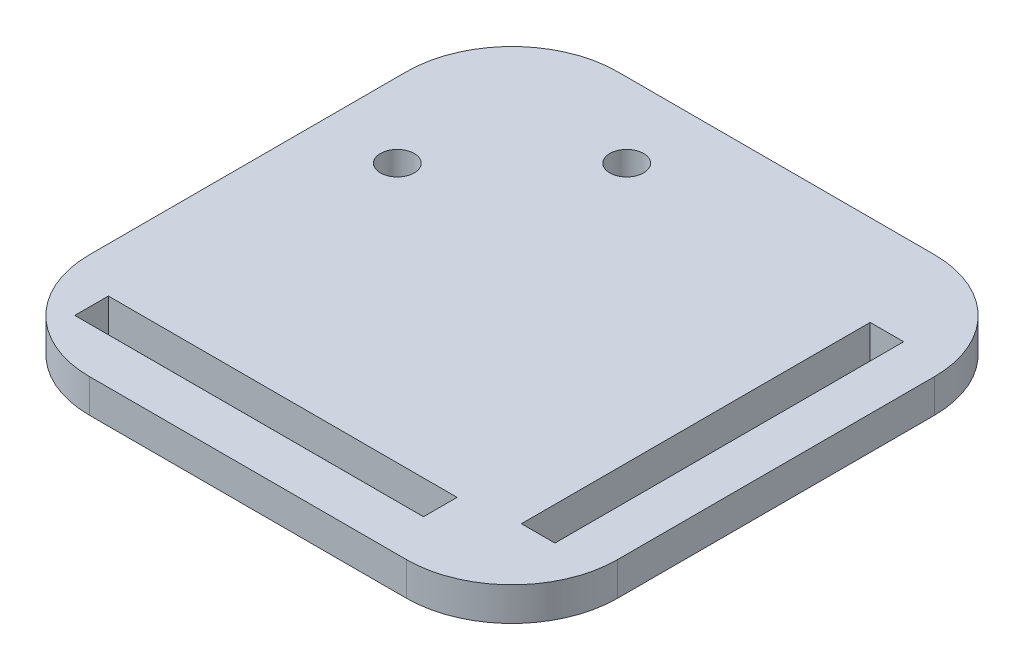
ISO-10303-21;
HEADER;
FILE_DESCRIPTION(('STEP AP214'),'2;1');
FILE_NAME('part.step','',(''),(''),'','','');
FILE_SCHEMA(('AUTOMOTIVE_DESIGN { 1 0 10303 214 1 1 1 1 }'));
ENDSEC;
DATA;
#1=APPLICATION_CONTEXT('core data for automotive mechanical design processes');
#2=APPLICATION_PROTOCOL_DEFINITION('international standard','automotive_design',2000,#1);
#3=PRODUCT_CONTEXT('',#1,'mechanical');
#4=PRODUCT('Part','Part','',(#3));
#5=PRODUCT_RELATED_PRODUCT_CATEGORY('part','',(#4));
#6=PRODUCT_DEFINITION_FORMATION('','',#4);
#7=PRODUCT_DEFINITION_CONTEXT('part definition',#1,'design');
#8=PRODUCT_DEFINITION('design','',#6,#7);
#9=PRODUCT_DEFINITION_SHAPE('','',#8);
#10=(LENGTH_UNIT() NAMED_UNIT(*) SI_UNIT(.MILLI.,.METRE.));
#11=(NAMED_UNIT(*) PLANE_ANGLE_UNIT() SI_UNIT($,.RADIAN.));
#12=(NAMED_UNIT(*) SI_UNIT($,.STERADIAN.) SOLID_ANGLE_UNIT());
#13=UNCERTAINTY_MEASURE_WITH_UNIT(LENGTH_MEASURE(1.E-05),#10,'distance_accuracy_value','');
#14=(GEOMETRIC_REPRESENTATION_CONTEXT(3) GLOBAL_UNCERTAINTY_ASSIGNED_CONTEXT((#13)) GLOBAL_UNIT_ASSIGNED_CONTEXT((#10,
#11,#12)) REPRESENTATION_CONTEXT('',''));
#15=CARTESIAN_POINT('',(0.,0.,0.));
#16=DIRECTION('',(0.,0.,1.));
#17=DIRECTION('',(1.,0.,0.));
#18=AXIS2_PLACEMENT_3D('',#15,#16,#17);
#19=CARTESIAN_POINT('',(25.,3.175,-25.));
#20=DIRECTION('',(-1.,0.,0.));
#21=DIRECTION('',(0.,0.,1.));
#22=AXIS2_PLACEMENT_3D('',#19,#20,#21);
#23=PLANE('',#22);
#24=DIRECTION('',(0.,0.,-1.));
#25=VECTOR('',#24,1.);
#26=CARTESIAN_POINT('',(25.,0.,-25.));
#27=LINE('',#26,#25);
#28=CARTESIAN_POINT('',(25.,0.,15.));
#29=VERTEX_POINT('',#28);
#30=CARTESIAN_POINT('',(25.,0.,-15.));
#31=VERTEX_POINT('',#30);
#32=EDGE_CURVE('E220',#29,#31,#27,.T.);
#33=ORIENTED_EDGE('',*,*,#32,.T.);
#34=DIRECTION('',(0.,-1.,0.));
#35=VECTOR('',#34,1.);
#36=CARTESIAN_POINT('',(25.,3.175,-15.));
#37=LINE('',#36,#35);
#38=CARTESIAN_POINT('',(25.,3.175,-15.));
#39=VERTEX_POINT('',#38);
#40=EDGE_CURVE('E11',#31,#39,#37,.F.);
#41=ORIENTED_EDGE('',*,*,#40,.T.);
#42=DIRECTION('',(0.,0.,-1.));
#43=VECTOR('',#42,1.);
#44=CARTESIAN_POINT('',(25.,3.175,-25.));
#45=LINE('',#44,#43);
#46=CARTESIAN_POINT('',(25.,3.175,15.));
#47=VERTEX_POINT('',#46);
#48=EDGE_CURVE('E227',#47,#39,#45,.T.);
#49=ORIENTED_EDGE('',*,*,#48,.F.);
#50=DIRECTION('',(0.,-1.,0.));
#51=VECTOR('',#50,1.);
#52=CARTESIAN_POINT('',(25.,3.175,15.));
#53=LINE('',#52,#51);
#54=EDGE_CURVE('E41',#47,#29,#53,.T.);
#55=ORIENTED_EDGE('',*,*,#54,.T.);
#56=EDGE_LOOP('',(#33,#41,#49,#55));
#57=FACE_BOUND('',#56,.T.);
#58=ADVANCED_FACE('F33',(#57),#23,.F.);
#59=CARTESIAN_POINT('',(-25.,3.175,-25.));
#60=DIRECTION('',(0.,0.,1.));
#61=DIRECTION('',(1.,0.,0.));
#62=AXIS2_PLACEMENT_3D('',#59,#60,#61);
#63=PLANE('',#62);
#64=DIRECTION('',(-1.,0.,0.));
#65=VECTOR('',#64,1.);
#66=CARTESIAN_POINT('',(-25.,0.,-25.));
#67=LINE('',#66,#65);
#68=CARTESIAN_POINT('',(15.,0.,-25.));
#69=VERTEX_POINT('',#68);
#70=CARTESIAN_POINT('',(-15.,0.,-25.));
#71=VERTEX_POINT('',#70);
#72=EDGE_CURVE('E241',#69,#71,#67,.T.);
#73=ORIENTED_EDGE('',*,*,#72,.T.);
#74=DIRECTION('',(0.,-1.,0.));
#75=VECTOR('',#74,1.);
#76=CARTESIAN_POINT('',(-15.,3.175,-25.));
#77=LINE('',#76,#75);
#78=CARTESIAN_POINT('',(-15.,3.175,-25.));
#79=VERTEX_POINT('',#78);
#80=EDGE_CURVE('E263',#71,#79,#77,.F.);
#81=ORIENTED_EDGE('',*,*,#80,.T.);
#82=DIRECTION('',(-1.,0.,0.));
#83=VECTOR('',#82,1.);
#84=CARTESIAN_POINT('',(-25.,3.175,-25.));
#85=LINE('',#84,#83);
#86=CARTESIAN_POINT('',(15.,3.175,-25.));
#87=VERTEX_POINT('',#86);
#88=EDGE_CURVE('E230',#87,#79,#85,.T.);
#89=ORIENTED_EDGE('',*,*,#88,.F.);
#90=DIRECTION('',(0.,-1.,0.));
#91=VECTOR('',#90,1.);
#92=CARTESIAN_POINT('',(15.,3.175,-25.));
#93=LINE('',#92,#91);
#94=EDGE_CURVE('E260',#87,#69,#93,.T.);
#95=ORIENTED_EDGE('',*,*,#94,.T.);
#96=EDGE_LOOP('',(#73,#81,#89,#95));
#97=FACE_BOUND('',#96,.T.);
#98=ADVANCED_FACE('F293',(#97),#63,.F.);
#99=CARTESIAN_POINT('',(-25.,3.175,-25.));
#100=DIRECTION('',(1.,0.,0.));
#101=DIRECTION('',(0.,0.,-1.));
#102=AXIS2_PLACEMENT_3D('',#99,#100,#101);
#103=PLANE('',#102);
#104=DIRECTION('',(0.,0.,1.));
#105=VECTOR('',#104,1.);
#106=CARTESIAN_POINT('',(-25.,3.175,-25.));
#107=LINE('',#106,#105);
#108=CARTESIAN_POINT('',(-25.,3.175,-15.));
#109=VERTEX_POINT('',#108);
#110=CARTESIAN_POINT('',(-25.,3.175,15.));
#111=VERTEX_POINT('',#110);
#112=EDGE_CURVE('E234',#109,#111,#107,.T.);
#113=ORIENTED_EDGE('',*,*,#112,.F.);
#114=DIRECTION('',(0.,-1.,0.));
#115=VECTOR('',#114,1.);
#116=CARTESIAN_POINT('',(-25.,3.175,-15.));
#117=LINE('',#116,#115);
#118=CARTESIAN_POINT('',(-25.,0.,-15.));
#119=VERTEX_POINT('',#118);
#120=EDGE_CURVE('E249',#109,#119,#117,.T.);
#121=ORIENTED_EDGE('',*,*,#120,.T.);
#122=DIRECTION('',(0.,0.,1.));
#123=VECTOR('',#122,1.);
#124=CARTESIAN_POINT('',(-25.,0.,-25.));
#125=LINE('',#124,#123);
#126=CARTESIAN_POINT('',(-25.,0.,15.));
#127=VERTEX_POINT('',#126);
#128=EDGE_CURVE('E244',#119,#127,#125,.T.);
#129=ORIENTED_EDGE('',*,*,#128,.T.);
#130=DIRECTION('',(0.,-1.,0.));
#131=VECTOR('',#130,1.);
#132=CARTESIAN_POINT('',(-25.,3.175,15.));
#133=LINE('',#132,#131);
#134=EDGE_CURVE('E238',#127,#111,#133,.F.);
#135=ORIENTED_EDGE('',*,*,#134,.T.);
#136=EDGE_LOOP('',(#113,#121,#129,#135));
#137=FACE_BOUND('',#136,.T.);
#138=ADVANCED_FACE('F302',(#137),#103,.F.);
#139=CARTESIAN_POINT('',(-25.,3.175,25.));
#140=DIRECTION('',(0.,0.,-1.));
#141=DIRECTION('',(-1.,0.,0.));
#142=AXIS2_PLACEMENT_3D('',#139,#140,#141);
#143=PLANE('',#142);
#144=DIRECTION('',(1.,0.,0.));
#145=VECTOR('',#144,1.);
#146=CARTESIAN_POINT('',(-25.,3.175,25.));
#147=LINE('',#146,#145);
#148=CARTESIAN_POINT('',(-15.,3.175,25.));
#149=VERTEX_POINT('',#148);
#150=CARTESIAN_POINT('',(15.,3.175,25.));
#151=VERTEX_POINT('',#150);
#152=EDGE_CURVE('E236',#149,#151,#147,.T.);
#153=ORIENTED_EDGE('',*,*,#152,.F.);
#154=DIRECTION('',(0.,-1.,0.));
#155=VECTOR('',#154,1.);
#156=CARTESIAN_POINT('',(-15.,3.175,25.));
#157=LINE('',#156,#155);
#158=CARTESIAN_POINT('',(-15.,0.,25.));
#159=VERTEX_POINT('',#158);
#160=EDGE_CURVE('E273',#149,#159,#157,.T.);
#161=ORIENTED_EDGE('',*,*,#160,.T.);
#162=DIRECTION('',(1.,0.,0.));
#163=VECTOR('',#162,1.);
#164=CARTESIAN_POINT('',(-25.,0.,25.));
#165=LINE('',#164,#163);
#166=CARTESIAN_POINT('',(15.,0.,25.));
#167=VERTEX_POINT('',#166);
#168=EDGE_CURVE('E231',#159,#167,#165,.T.);
#169=ORIENTED_EDGE('',*,*,#168,.T.);
#170=DIRECTION('',(0.,-1.,0.));
#171=VECTOR('',#170,1.);
#172=CARTESIAN_POINT('',(15.,3.175,25.));
#173=LINE('',#172,#171);
#174=EDGE_CURVE('E48',#167,#151,#173,.F.);
#175=ORIENTED_EDGE('',*,*,#174,.T.);
#176=EDGE_LOOP('',(#153,#161,#169,#175));
#177=FACE_BOUND('',#176,.T.);
#178=ADVANCED_FACE('F307',(#177),#143,.F.);
#179=CARTESIAN_POINT('',(0.,3.175,0.));
#180=DIRECTION('',(0.,1.,0.));
#181=DIRECTION('',(0.,0.,1.));
#182=AXIS2_PLACEMENT_3D('',#179,#180,#181);
#183=PLANE('',#182);
#184=CARTESIAN_POINT('',(-17.9289321881345,3.175,-7.07106781186547));
#185=DIRECTION('',(0.,1.,0.));
#186=DIRECTION('',(0.,0.,1.));
#187=AXIS2_PLACEMENT_3D('',#184,#185,#186);
#188=CIRCLE('',#187,1.6);
#189=CARTESIAN_POINT('',(-17.9289321881345,3.175,-5.47106781186547));
#190=VERTEX_POINT('',#189);
#191=EDGE_CURVE('E477',#190,#190,#188,.T.);
#192=ORIENTED_EDGE('',*,*,#191,.F.);
#193=EDGE_LOOP('',(#192));
#194=FACE_BOUND('',#193,.T.);
#195=CARTESIAN_POINT('',(-7.07106781186546,3.175,-17.9289321881345));
#196=DIRECTION('',(0.,1.,0.));
#197=DIRECTION('',(0.,0.,1.));
#198=AXIS2_PLACEMENT_3D('',#195,#196,#197);
#199=CIRCLE('',#198,1.6);
#200=CARTESIAN_POINT('',(-7.07106781186546,3.175,-16.3289321881345));
#201=VERTEX_POINT('',#200);
#202=EDGE_CURVE('E178',#201,#201,#199,.T.);
#203=ORIENTED_EDGE('',*,*,#202,.F.);
#204=EDGE_LOOP('',(#203));
#205=FACE_BOUND('',#204,.T.);
#206=DIRECTION('',(0.,0.,-1.));
#207=VECTOR('',#206,1.);
#208=CARTESIAN_POINT('',(12.3,3.175,17.5));
#209=LINE('',#208,#207);
#210=CARTESIAN_POINT('',(12.3,3.175,20.68));
#211=VERTEX_POINT('',#210);
#212=CARTESIAN_POINT('',(12.3,3.175,17.5));
#213=VERTEX_POINT('',#212);
#214=EDGE_CURVE('E154',#211,#213,#209,.T.);
#215=ORIENTED_EDGE('',*,*,#214,.F.);
#216=DIRECTION('',(1.,0.,0.));
#217=VECTOR('',#216,1.);
#218=CARTESIAN_POINT('',(-20.72,3.175,20.68));
#219=LINE('',#218,#217);
#220=CARTESIAN_POINT('',(-20.72,3.175,20.68));
#221=VERTEX_POINT('',#220);
#222=EDGE_CURVE('E172',#221,#211,#219,.T.);
#223=ORIENTED_EDGE('',*,*,#222,.F.);
#224=DIRECTION('',(0.,0.,1.));
#225=VECTOR('',#224,1.);
#226=CARTESIAN_POINT('',(-20.72,3.175,17.5));
#227=LINE('',#226,#225);
#228=CARTESIAN_POINT('',(-20.72,3.175,17.5));
#229=VERTEX_POINT('',#228);
#230=EDGE_CURVE('E175',#229,#221,#227,.T.);
#231=ORIENTED_EDGE('',*,*,#230,.F.);
#232=DIRECTION('',(-1.,0.,0.));
#233=VECTOR('',#232,1.);
#234=CARTESIAN_POINT('',(-20.72,3.175,17.5));
#235=LINE('',#234,#233);
#236=EDGE_CURVE('E184',#213,#229,#235,.T.);
#237=ORIENTED_EDGE('',*,*,#236,.F.);
#238=EDGE_LOOP('',(#215,#223,#231,#237));
#239=FACE_BOUND('',#238,.T.);
#240=DIRECTION('',(0.,0.,-1.));
#241=VECTOR('',#240,1.);
#242=CARTESIAN_POINT('',(20.682,3.175,-16.402));
#243=LINE('',#242,#241);
#244=CARTESIAN_POINT('',(20.682,3.175,16.618));
#245=VERTEX_POINT('',#244);
#246=CARTESIAN_POINT('',(20.682,3.175,-16.402));
#247=VERTEX_POINT('',#246);
#248=EDGE_CURVE('E191',#245,#247,#243,.T.);
#249=ORIENTED_EDGE('',*,*,#248,.F.);
#250=DIRECTION('',(1.,0.,0.));
#251=VECTOR('',#250,1.);
#252=CARTESIAN_POINT('',(17.507,3.175,16.618));
#253=LINE('',#252,#251);
#254=CARTESIAN_POINT('',(17.507,3.175,16.618));
#255=VERTEX_POINT('',#254);
#256=EDGE_CURVE('E199',#255,#245,#253,.T.);
#257=ORIENTED_EDGE('',*,*,#256,.F.);
#258=DIRECTION('',(0.,0.,1.));
#259=VECTOR('',#258,1.);
#260=CARTESIAN_POINT('',(17.507,3.175,-16.402));
#261=LINE('',#260,#259);
#262=CARTESIAN_POINT('',(17.507,3.175,-16.402));
#263=VERTEX_POINT('',#262);
#264=EDGE_CURVE('E213',#263,#255,#261,.T.);
#265=ORIENTED_EDGE('',*,*,#264,.F.);
#266=DIRECTION('',(-1.,0.,0.));
#267=VECTOR('',#266,1.);
#268=CARTESIAN_POINT('',(17.507,3.175,-16.402));
#269=LINE('',#268,#267);
#270=EDGE_CURVE('E210',#247,#263,#269,.T.);
#271=ORIENTED_EDGE('',*,*,#270,.F.);
#272=EDGE_LOOP('',(#249,#257,#265,#271));
#273=FACE_BOUND('',#272,.T.);
#274=ORIENTED_EDGE('',*,*,#88,.T.);
#275=CARTESIAN_POINT('',(-15.,3.175,-15.));
#276=DIRECTION('',(0.,1.,0.));
#277=DIRECTION('',(0.,0.,1.));
#278=AXIS2_PLACEMENT_3D('',#275,#276,#277);
#279=CIRCLE('',#278,10.);
#280=EDGE_CURVE('E270',#79,#109,#279,.T.);
#281=ORIENTED_EDGE('',*,*,#280,.T.);
#282=ORIENTED_EDGE('',*,*,#112,.T.);
#283=CARTESIAN_POINT('',(-15.,3.175,15.));
#284=DIRECTION('',(0.,1.,0.));
#285=DIRECTION('',(0.,0.,1.));
#286=AXIS2_PLACEMENT_3D('',#283,#284,#285);
#287=CIRCLE('',#286,10.);
#288=EDGE_CURVE('E55',#111,#149,#287,.T.);
#289=ORIENTED_EDGE('',*,*,#288,.T.);
#290=ORIENTED_EDGE('',*,*,#152,.T.);
#291=CARTESIAN_POINT('',(15.,3.175,15.));
#292=DIRECTION('',(0.,1.,0.));
#293=DIRECTION('',(0.,0.,1.));
#294=AXIS2_PLACEMENT_3D('',#291,#292,#293);
#295=CIRCLE('',#294,10.);
#296=EDGE_CURVE('E265',#151,#47,#295,.T.);
#297=ORIENTED_EDGE('',*,*,#296,.T.);
#298=ORIENTED_EDGE('',*,*,#48,.T.);
#299=CARTESIAN_POINT('',(15.,3.175,-15.));
#300=DIRECTION('',(0.,1.,0.));
#301=DIRECTION('',(0.,0.,1.));
#302=AXIS2_PLACEMENT_3D('',#299,#300,#301);
#303=CIRCLE('',#302,10.);
#304=EDGE_CURVE('E267',#39,#87,#303,.T.);
#305=ORIENTED_EDGE('',*,*,#304,.T.);
#306=EDGE_LOOP('',(#274,#281,#282,#289,#290,#297,#298,#305));
#307=FACE_BOUND('',#306,.T.);
#308=ADVANCED_FACE('F296',(#194,#205,#239,#273,#307),#183,.T.);
#309=CARTESIAN_POINT('',(0.,0.,0.));
#310=DIRECTION('',(0.,1.,0.));
#311=DIRECTION('',(0.,0.,1.));
#312=AXIS2_PLACEMENT_3D('',#309,#310,#311);
#313=PLANE('',#312);
#314=CARTESIAN_POINT('',(-17.9289321881345,0.,-7.07106781186547));
#315=DIRECTION('',(0.,1.,0.));
#316=DIRECTION('',(0.,0.,1.));
#317=AXIS2_PLACEMENT_3D('',#314,#315,#316);
#318=CIRCLE('',#317,1.6);
#319=CARTESIAN_POINT('',(-17.9289321881345,0.,-5.47106781186547));
#320=VERTEX_POINT('',#319);
#321=EDGE_CURVE('E493',#320,#320,#318,.T.);
#322=ORIENTED_EDGE('',*,*,#321,.T.);
#323=EDGE_LOOP('',(#322));
#324=FACE_BOUND('',#323,.T.);
#325=CARTESIAN_POINT('',(-7.07106781186546,0.,-17.9289321881345));
#326=DIRECTION('',(0.,1.,0.));
#327=DIRECTION('',(0.,0.,1.));
#328=AXIS2_PLACEMENT_3D('',#325,#326,#327);
#329=CIRCLE('',#328,1.6);
#330=CARTESIAN_POINT('',(-7.07106781186546,0.,-16.3289321881345));
#331=VERTEX_POINT('',#330);
#332=EDGE_CURVE('E185',#331,#331,#329,.T.);
#333=ORIENTED_EDGE('',*,*,#332,.T.);
#334=EDGE_LOOP('',(#333));
#335=FACE_BOUND('',#334,.T.);
#336=DIRECTION('',(1.,0.,0.));
#337=VECTOR('',#336,1.);
#338=CARTESIAN_POINT('',(-20.72,0.,20.68));
#339=LINE('',#338,#337);
#340=CARTESIAN_POINT('',(-20.72,0.,20.68));
#341=VERTEX_POINT('',#340);
#342=CARTESIAN_POINT('',(12.3,0.,20.68));
#343=VERTEX_POINT('',#342);
#344=EDGE_CURVE('E159',#341,#343,#339,.T.);
#345=ORIENTED_EDGE('',*,*,#344,.T.);
#346=DIRECTION('',(0.,0.,-1.));
#347=VECTOR('',#346,1.);
#348=CARTESIAN_POINT('',(12.3,0.,17.5));
#349=LINE('',#348,#347);
#350=CARTESIAN_POINT('',(12.3,0.,17.5));
#351=VERTEX_POINT('',#350);
#352=EDGE_CURVE('E151',#343,#351,#349,.T.);
#353=ORIENTED_EDGE('',*,*,#352,.T.);
#354=DIRECTION('',(-1.,0.,0.));
#355=VECTOR('',#354,1.);
#356=CARTESIAN_POINT('',(-20.72,0.,17.5));
#357=LINE('',#356,#355);
#358=CARTESIAN_POINT('',(-20.72,0.,17.5));
#359=VERTEX_POINT('',#358);
#360=EDGE_CURVE('E163',#351,#359,#357,.T.);
#361=ORIENTED_EDGE('',*,*,#360,.T.);
#362=DIRECTION('',(0.,0.,1.));
#363=VECTOR('',#362,1.);
#364=CARTESIAN_POINT('',(-20.72,0.,17.5));
#365=LINE('',#364,#363);
#366=EDGE_CURVE('E167',#359,#341,#365,.T.);
#367=ORIENTED_EDGE('',*,*,#366,.T.);
#368=EDGE_LOOP('',(#345,#353,#361,#367));
#369=FACE_BOUND('',#368,.T.);
#370=DIRECTION('',(1.,0.,0.));
#371=VECTOR('',#370,1.);
#372=CARTESIAN_POINT('',(17.507,0.,16.618));
#373=LINE('',#372,#371);
#374=CARTESIAN_POINT('',(17.507,0.,16.618));
#375=VERTEX_POINT('',#374);
#376=CARTESIAN_POINT('',(20.682,0.,16.618));
#377=VERTEX_POINT('',#376);
#378=EDGE_CURVE('E205',#375,#377,#373,.T.);
#379=ORIENTED_EDGE('',*,*,#378,.T.);
#380=DIRECTION('',(0.,0.,-1.));
#381=VECTOR('',#380,1.);
#382=CARTESIAN_POINT('',(20.682,0.,-16.402));
#383=LINE('',#382,#381);
#384=CARTESIAN_POINT('',(20.682,0.,-16.402));
#385=VERTEX_POINT('',#384);
#386=EDGE_CURVE('E195',#377,#385,#383,.T.);
#387=ORIENTED_EDGE('',*,*,#386,.T.);
#388=DIRECTION('',(-1.,0.,0.));
#389=VECTOR('',#388,1.);
#390=CARTESIAN_POINT('',(17.507,0.,-16.402));
#391=LINE('',#390,#389);
#392=CARTESIAN_POINT('',(17.507,0.,-16.402));
#393=VERTEX_POINT('',#392);
#394=EDGE_CURVE('E198',#385,#393,#391,.T.);
#395=ORIENTED_EDGE('',*,*,#394,.T.);
#396=DIRECTION('',(0.,0.,1.));
#397=VECTOR('',#396,1.);
#398=CARTESIAN_POINT('',(17.507,0.,-16.402));
#399=LINE('',#398,#397);
#400=EDGE_CURVE('E202',#393,#375,#399,.T.);
#401=ORIENTED_EDGE('',*,*,#400,.T.);
#402=EDGE_LOOP('',(#379,#387,#395,#401));
#403=FACE_BOUND('',#402,.T.);
#404=ORIENTED_EDGE('',*,*,#128,.F.);
#405=CARTESIAN_POINT('',(-15.,0.,-15.));
#406=DIRECTION('',(0.,1.,0.));
#407=DIRECTION('',(0.,0.,1.));
#408=AXIS2_PLACEMENT_3D('',#405,#406,#407);
#409=CIRCLE('',#408,10.);
#410=EDGE_CURVE('E258',#119,#71,#409,.F.);
#411=ORIENTED_EDGE('',*,*,#410,.T.);
#412=ORIENTED_EDGE('',*,*,#72,.F.);
#413=CARTESIAN_POINT('',(15.,0.,-15.));
#414=DIRECTION('',(0.,1.,0.));
#415=DIRECTION('',(0.,0.,1.));
#416=AXIS2_PLACEMENT_3D('',#413,#414,#415);
#417=CIRCLE('',#416,10.);
#418=EDGE_CURVE('E254',#69,#31,#417,.F.);
#419=ORIENTED_EDGE('',*,*,#418,.T.);
#420=ORIENTED_EDGE('',*,*,#32,.F.);
#421=CARTESIAN_POINT('',(15.,0.,15.));
#422=DIRECTION('',(0.,1.,0.));
#423=DIRECTION('',(0.,0.,1.));
#424=AXIS2_PLACEMENT_3D('',#421,#422,#423);
#425=CIRCLE('',#424,10.);
#426=EDGE_CURVE('E252',#29,#167,#425,.F.);
#427=ORIENTED_EDGE('',*,*,#426,.T.);
#428=ORIENTED_EDGE('',*,*,#168,.F.);
#429=CARTESIAN_POINT('',(-15.,0.,15.));
#430=DIRECTION('',(0.,1.,0.));
#431=DIRECTION('',(0.,0.,1.));
#432=AXIS2_PLACEMENT_3D('',#429,#430,#431);
#433=CIRCLE('',#432,10.);
#434=EDGE_CURVE('E256',#159,#127,#433,.F.);
#435=ORIENTED_EDGE('',*,*,#434,.T.);
#436=EDGE_LOOP('',(#404,#411,#412,#419,#420,#427,#428,#435));
#437=FACE_BOUND('',#436,.T.);
#438=ADVANCED_FACE('F169',(#324,#335,#369,#403,#437),#313,.F.);
#439=CARTESIAN_POINT('',(20.682,0.,-16.402));
#440=DIRECTION('',(1.,0.,0.));
#441=DIRECTION('',(0.,0.,-1.));
#442=AXIS2_PLACEMENT_3D('',#439,#440,#441);
#443=PLANE('',#442);
#444=ORIENTED_EDGE('',*,*,#248,.T.);
#445=DIRECTION('',(0.,1.,0.));
#446=VECTOR('',#445,1.);
#447=CARTESIAN_POINT('',(20.682,0.,-16.402));
#448=LINE('',#447,#446);
#449=EDGE_CURVE('E208',#385,#247,#448,.T.);
#450=ORIENTED_EDGE('',*,*,#449,.F.);
#451=ORIENTED_EDGE('',*,*,#386,.F.);
#452=DIRECTION('',(0.,1.,0.));
#453=VECTOR('',#452,1.);
#454=CARTESIAN_POINT('',(20.682,0.,16.618));
#455=LINE('',#454,#453);
#456=EDGE_CURVE('E218',#377,#245,#455,.T.);
#457=ORIENTED_EDGE('',*,*,#456,.T.);
#458=EDGE_LOOP('',(#444,#450,#451,#457));
#459=FACE_BOUND('',#458,.T.);
#460=ADVANCED_FACE('F421',(#459),#443,.F.);
#461=CARTESIAN_POINT('',(17.507,0.,16.618));
#462=DIRECTION('',(0.,0.,1.));
#463=DIRECTION('',(1.,0.,0.));
#464=AXIS2_PLACEMENT_3D('',#461,#462,#463);
#465=PLANE('',#464);
#466=ORIENTED_EDGE('',*,*,#256,.T.);
#467=ORIENTED_EDGE('',*,*,#456,.F.);
#468=ORIENTED_EDGE('',*,*,#378,.F.);
#469=DIRECTION('',(0.,1.,0.));
#470=VECTOR('',#469,1.);
#471=CARTESIAN_POINT('',(17.507,0.,16.618));
#472=LINE('',#471,#470);
#473=EDGE_CURVE('E221',#375,#255,#472,.T.);
#474=ORIENTED_EDGE('',*,*,#473,.T.);
#475=EDGE_LOOP('',(#466,#467,#468,#474));
#476=FACE_BOUND('',#475,.T.);
#477=ADVANCED_FACE('F412',(#476),#465,.F.);
#478=CARTESIAN_POINT('',(17.507,0.,-16.402));
#479=DIRECTION('',(-1.,0.,0.));
#480=DIRECTION('',(0.,0.,1.));
#481=AXIS2_PLACEMENT_3D('',#478,#479,#480);
#482=PLANE('',#481);
#483=ORIENTED_EDGE('',*,*,#264,.T.);
#484=ORIENTED_EDGE('',*,*,#473,.F.);
#485=ORIENTED_EDGE('',*,*,#400,.F.);
#486=DIRECTION('',(0.,1.,0.));
#487=VECTOR('',#486,1.);
#488=CARTESIAN_POINT('',(17.507,0.,-16.402));
#489=LINE('',#488,#487);
#490=EDGE_CURVE('E223',#393,#263,#489,.T.);
#491=ORIENTED_EDGE('',*,*,#490,.T.);
#492=EDGE_LOOP('',(#483,#484,#485,#491));
#493=FACE_BOUND('',#492,.T.);
#494=ADVANCED_FACE('F403',(#493),#482,.F.);
#495=CARTESIAN_POINT('',(17.507,0.,-16.402));
#496=DIRECTION('',(0.,0.,-1.));
#497=DIRECTION('',(-1.,0.,0.));
#498=AXIS2_PLACEMENT_3D('',#495,#496,#497);
#499=PLANE('',#498);
#500=ORIENTED_EDGE('',*,*,#270,.T.);
#501=ORIENTED_EDGE('',*,*,#490,.F.);
#502=ORIENTED_EDGE('',*,*,#394,.F.);
#503=ORIENTED_EDGE('',*,*,#449,.T.);
#504=EDGE_LOOP('',(#500,#501,#502,#503));
#505=FACE_BOUND('',#504,.T.);
#506=ADVANCED_FACE('F395',(#505),#499,.F.);
#507=CARTESIAN_POINT('',(12.3,0.,17.5));
#508=DIRECTION('',(1.,0.,0.));
#509=DIRECTION('',(0.,0.,-1.));
#510=AXIS2_PLACEMENT_3D('',#507,#508,#509);
#511=PLANE('',#510);
#512=ORIENTED_EDGE('',*,*,#214,.T.);
#513=DIRECTION('',(0.,1.,0.));
#514=VECTOR('',#513,1.);
#515=CARTESIAN_POINT('',(12.3,0.,17.5));
#516=LINE('',#515,#514);
#517=EDGE_CURVE('E147',#351,#213,#516,.T.);
#518=ORIENTED_EDGE('',*,*,#517,.F.);
#519=ORIENTED_EDGE('',*,*,#352,.F.);
#520=DIRECTION('',(0.,1.,0.));
#521=VECTOR('',#520,1.);
#522=CARTESIAN_POINT('',(12.3,0.,20.68));
#523=LINE('',#522,#521);
#524=EDGE_CURVE('E189',#343,#211,#523,.T.);
#525=ORIENTED_EDGE('',*,*,#524,.T.);
#526=EDGE_LOOP('',(#512,#518,#519,#525));
#527=FACE_BOUND('',#526,.T.);
#528=ADVANCED_FACE('F149',(#527),#511,.F.);
#529=CARTESIAN_POINT('',(-20.72,0.,20.68));
#530=DIRECTION('',(0.,0.,1.));
#531=DIRECTION('',(1.,0.,0.));
#532=AXIS2_PLACEMENT_3D('',#529,#530,#531);
#533=PLANE('',#532);
#534=ORIENTED_EDGE('',*,*,#222,.T.);
#535=ORIENTED_EDGE('',*,*,#524,.F.);
#536=ORIENTED_EDGE('',*,*,#344,.F.);
#537=DIRECTION('',(0.,1.,0.));
#538=VECTOR('',#537,1.);
#539=CARTESIAN_POINT('',(-20.72,0.,20.68));
#540=LINE('',#539,#538);
#541=EDGE_CURVE('E192',#341,#221,#540,.T.);
#542=ORIENTED_EDGE('',*,*,#541,.T.);
#543=EDGE_LOOP('',(#534,#535,#536,#542));
#544=FACE_BOUND('',#543,.T.);
#545=ADVANCED_FACE('F378',(#544),#533,.F.);
#546=CARTESIAN_POINT('',(-20.72,0.,17.5));
#547=DIRECTION('',(-1.,0.,0.));
#548=DIRECTION('',(0.,0.,1.));
#549=AXIS2_PLACEMENT_3D('',#546,#547,#548);
#550=PLANE('',#549);
#551=ORIENTED_EDGE('',*,*,#230,.T.);
#552=ORIENTED_EDGE('',*,*,#541,.F.);
#553=ORIENTED_EDGE('',*,*,#366,.F.);
#554=DIRECTION('',(0.,1.,0.));
#555=VECTOR('',#554,1.);
#556=CARTESIAN_POINT('',(-20.72,0.,17.5));
#557=LINE('',#556,#555);
#558=EDGE_CURVE('E158',#359,#229,#557,.T.);
#559=ORIENTED_EDGE('',*,*,#558,.T.);
#560=EDGE_LOOP('',(#551,#552,#553,#559));
#561=FACE_BOUND('',#560,.T.);
#562=ADVANCED_FACE('F370',(#561),#550,.F.);
#563=CARTESIAN_POINT('',(-20.72,0.,17.5));
#564=DIRECTION('',(0.,0.,-1.));
#565=DIRECTION('',(-1.,0.,0.));
#566=AXIS2_PLACEMENT_3D('',#563,#564,#565);
#567=PLANE('',#566);
#568=ORIENTED_EDGE('',*,*,#236,.T.);
#569=ORIENTED_EDGE('',*,*,#558,.F.);
#570=ORIENTED_EDGE('',*,*,#360,.F.);
#571=ORIENTED_EDGE('',*,*,#517,.T.);
#572=EDGE_LOOP('',(#568,#569,#570,#571));
#573=FACE_BOUND('',#572,.T.);
#574=ADVANCED_FACE('F164',(#573),#567,.F.);
#575=CARTESIAN_POINT('',(-7.07106781186546,0.,-17.9289321881345));
#576=DIRECTION('',(0.,1.,0.));
#577=DIRECTION('',(0.,0.,1.));
#578=AXIS2_PLACEMENT_3D('',#575,#576,#577);
#579=CYLINDRICAL_SURFACE('',#578,1.6);
#580=ORIENTED_EDGE('',*,*,#332,.F.);
#581=EDGE_LOOP('',(#580));
#582=FACE_BOUND('',#581,.T.);
#583=ORIENTED_EDGE('',*,*,#202,.T.);
#584=EDGE_LOOP('',(#583));
#585=FACE_BOUND('',#584,.T.);
#586=ADVANCED_FACE('F353',(#582,#585),#579,.F.);
#587=CARTESIAN_POINT('',(-17.9289321881345,0.,-7.07106781186547));
#588=DIRECTION('',(0.,1.,0.));
#589=DIRECTION('',(0.,0.,1.));
#590=AXIS2_PLACEMENT_3D('',#587,#588,#589);
#591=CYLINDRICAL_SURFACE('',#590,1.6);
#592=ORIENTED_EDGE('',*,*,#321,.F.);
#593=EDGE_LOOP('',(#592));
#594=FACE_BOUND('',#593,.T.);
#595=ORIENTED_EDGE('',*,*,#191,.T.);
#596=EDGE_LOOP('',(#595));
#597=FACE_BOUND('',#596,.T.);
#598=ADVANCED_FACE('F323',(#594,#597),#591,.F.);
#599=CARTESIAN_POINT('',(-15.,3.175,-15.));
#600=DIRECTION('',(0.,-1.,0.));
#601=DIRECTION('',(0.,0.,-1.));
#602=AXIS2_PLACEMENT_3D('',#599,#600,#601);
#603=CYLINDRICAL_SURFACE('',#602,10.);
#604=ORIENTED_EDGE('',*,*,#280,.F.);
#605=ORIENTED_EDGE('',*,*,#80,.F.);
#606=ORIENTED_EDGE('',*,*,#410,.F.);
#607=ORIENTED_EDGE('',*,*,#120,.F.);
#608=EDGE_LOOP('',(#604,#605,#606,#607));
#609=FACE_BOUND('',#608,.T.);
#610=ADVANCED_FACE('F300',(#609),#603,.T.);
#611=CARTESIAN_POINT('',(-15.,3.175,15.));
#612=DIRECTION('',(0.,-1.,0.));
#613=DIRECTION('',(0.,0.,-1.));
#614=AXIS2_PLACEMENT_3D('',#611,#612,#613);
#615=CYLINDRICAL_SURFACE('',#614,10.);
#616=ORIENTED_EDGE('',*,*,#288,.F.);
#617=ORIENTED_EDGE('',*,*,#134,.F.);
#618=ORIENTED_EDGE('',*,*,#434,.F.);
#619=ORIENTED_EDGE('',*,*,#160,.F.);
#620=EDGE_LOOP('',(#616,#617,#618,#619));
#621=FACE_BOUND('',#620,.T.);
#622=ADVANCED_FACE('F306',(#621),#615,.T.);
#623=CARTESIAN_POINT('',(15.,3.175,-15.));
#624=DIRECTION('',(0.,-1.,0.));
#625=DIRECTION('',(0.,0.,-1.));
#626=AXIS2_PLACEMENT_3D('',#623,#624,#625);
#627=CYLINDRICAL_SURFACE('',#626,10.);
#628=ORIENTED_EDGE('',*,*,#304,.F.);
#629=ORIENTED_EDGE('',*,*,#40,.F.);
#630=ORIENTED_EDGE('',*,*,#418,.F.);
#631=ORIENTED_EDGE('',*,*,#94,.F.);
#632=EDGE_LOOP('',(#628,#629,#630,#631));
#633=FACE_BOUND('',#632,.T.);
#634=ADVANCED_FACE('F290',(#633),#627,.T.);
#635=CARTESIAN_POINT('',(15.,3.175,15.));
#636=DIRECTION('',(0.,-1.,0.));
#637=DIRECTION('',(0.,0.,-1.));
#638=AXIS2_PLACEMENT_3D('',#635,#636,#637);
#639=CYLINDRICAL_SURFACE('',#638,10.);
#640=ORIENTED_EDGE('',*,*,#296,.F.);
#641=ORIENTED_EDGE('',*,*,#174,.F.);
#642=ORIENTED_EDGE('',*,*,#426,.F.);
#643=ORIENTED_EDGE('',*,*,#54,.F.);
#644=EDGE_LOOP('',(#640,#641,#642,#643));
#645=FACE_BOUND('',#644,.T.);
#646=ADVANCED_FACE('F35',(#645),#639,.T.);
#647=CLOSED_SHELL('',(#58,#98,#138,#178,#308,#438,#460,#477,#494,#506,#528,#545,#562,#574,#586,
#598,#610,#622,#634,#646));
#648=MANIFOLD_SOLID_BREP('B2',#647);
#649=ADVANCED_BREP_SHAPE_REPRESENTATION('',(#18,#648),#14);
#650=SHAPE_DEFINITION_REPRESENTATION(#9,#649);
ENDSEC;
END-ISO-10303-21;
